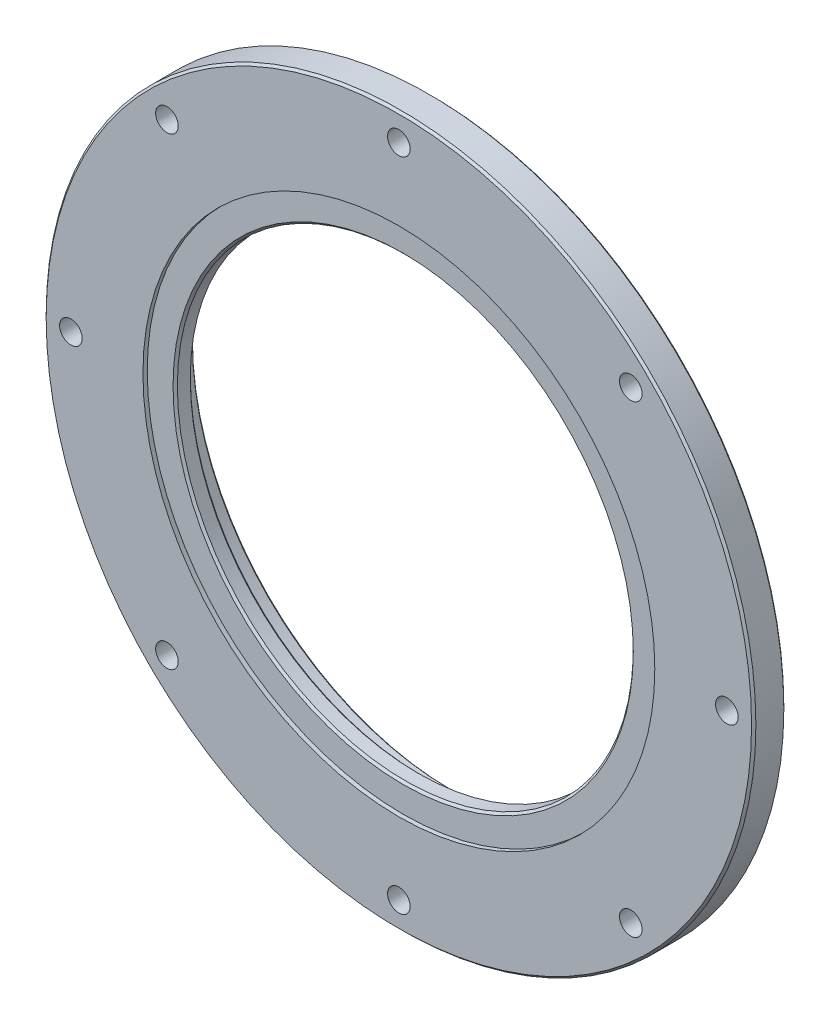
ISO-10303-21;
HEADER;
FILE_DESCRIPTION(('STEP AP214'),'2;1');
FILE_NAME('part.step','',(''),(''),'','','');
FILE_SCHEMA(('AUTOMOTIVE_DESIGN { 1 0 10303 214 1 1 1 1 }'));
ENDSEC;
DATA;
#1=APPLICATION_CONTEXT('core data for automotive mechanical design processes');
#2=APPLICATION_PROTOCOL_DEFINITION('international standard','automotive_design',2000,#1);
#3=PRODUCT_CONTEXT('',#1,'mechanical');
#4=PRODUCT('Part','Part','',(#3));
#5=PRODUCT_RELATED_PRODUCT_CATEGORY('part','',(#4));
#6=PRODUCT_DEFINITION_FORMATION('','',#4);
#7=PRODUCT_DEFINITION_CONTEXT('part definition',#1,'design');
#8=PRODUCT_DEFINITION('design','',#6,#7);
#9=PRODUCT_DEFINITION_SHAPE('','',#8);
#10=(LENGTH_UNIT() NAMED_UNIT(*) SI_UNIT(.MILLI.,.METRE.));
#11=(NAMED_UNIT(*) PLANE_ANGLE_UNIT() SI_UNIT($,.RADIAN.));
#12=(NAMED_UNIT(*) SI_UNIT($,.STERADIAN.) SOLID_ANGLE_UNIT());
#13=UNCERTAINTY_MEASURE_WITH_UNIT(LENGTH_MEASURE(1.E-05),#10,'distance_accuracy_value','');
#14=(GEOMETRIC_REPRESENTATION_CONTEXT(3) GLOBAL_UNCERTAINTY_ASSIGNED_CONTEXT((#13)) GLOBAL_UNIT_ASSIGNED_CONTEXT((#10,
#11,#12)) REPRESENTATION_CONTEXT('',''));
#15=CARTESIAN_POINT('',(0.,0.,0.));
#16=DIRECTION('',(0.,0.,1.));
#17=DIRECTION('',(1.,0.,0.));
#18=AXIS2_PLACEMENT_3D('',#15,#16,#17);
#19=CARTESIAN_POINT('',(0.,0.,0.));
#20=DIRECTION('',(0.,0.,-1.));
#21=DIRECTION('',(-1.,0.,0.));
#22=AXIS2_PLACEMENT_3D('',#19,#20,#21);
#23=CYLINDRICAL_SURFACE('',#22,165.);
#24=CARTESIAN_POINT('',(0.,0.,-14.0000000000001));
#25=DIRECTION('',(0.,0.,-1.));
#26=DIRECTION('',(-1.,0.,0.));
#27=AXIS2_PLACEMENT_3D('',#24,#25,#26);
#28=CIRCLE('',#27,165.);
#29=CARTESIAN_POINT('',(-165.,0.,-14.0000000000001));
#30=VERTEX_POINT('',#29);
#31=EDGE_CURVE('E60',#30,#30,#28,.F.);
#32=ORIENTED_EDGE('',*,*,#31,.T.);
#33=EDGE_LOOP('',(#32));
#34=FACE_BOUND('',#33,.T.);
#35=CARTESIAN_POINT('',(0.,0.,-1.00000000000004));
#36=DIRECTION('',(0.,0.,1.));
#37=DIRECTION('',(1.,0.,0.));
#38=AXIS2_PLACEMENT_3D('',#35,#36,#37);
#39=CIRCLE('',#38,165.);
#40=CARTESIAN_POINT('',(165.,0.,-1.00000000000004));
#41=VERTEX_POINT('',#40);
#42=EDGE_CURVE('E161',#41,#41,#39,.F.);
#43=ORIENTED_EDGE('',*,*,#42,.T.);
#44=EDGE_LOOP('',(#43));
#45=FACE_BOUND('',#44,.T.);
#46=ADVANCED_FACE('F51',(#34,#45),#23,.T.);
#47=CARTESIAN_POINT('',(165.,0.,0.));
#48=DIRECTION('',(0.,0.,1.));
#49=DIRECTION('',(1.,0.,0.));
#50=AXIS2_PLACEMENT_3D('',#47,#48,#49);
#51=PLANE('',#50);
#52=CARTESIAN_POINT('',(0.,0.,0.));
#53=DIRECTION('',(0.,0.,1.));
#54=DIRECTION('',(1.,0.,0.));
#55=AXIS2_PLACEMENT_3D('',#52,#53,#54);
#56=CIRCLE('',#55,164.);
#57=CARTESIAN_POINT('',(164.,0.,0.));
#58=VERTEX_POINT('',#57);
#59=EDGE_CURVE('E11',#58,#58,#56,.T.);
#60=ORIENTED_EDGE('',*,*,#59,.T.);
#61=EDGE_LOOP('',(#60));
#62=FACE_BOUND('',#61,.T.);
#63=CARTESIAN_POINT('',(-152.5,0.,0.));
#64=DIRECTION('',(0.,0.,-1.));
#65=DIRECTION('',(-1.,0.,0.));
#66=AXIS2_PLACEMENT_3D('',#63,#64,#65);
#67=CIRCLE('',#66,5.25);
#68=CARTESIAN_POINT('',(-157.75,0.,0.));
#69=VERTEX_POINT('',#68);
#70=EDGE_CURVE('E292',#69,#69,#67,.T.);
#71=ORIENTED_EDGE('',*,*,#70,.T.);
#72=EDGE_LOOP('',(#71));
#73=FACE_BOUND('',#72,.T.);
#74=CARTESIAN_POINT('',(-107.833784130948,-107.833784130949,0.));
#75=DIRECTION('',(0.,0.,-1.));
#76=DIRECTION('',(-1.,0.,0.));
#77=AXIS2_PLACEMENT_3D('',#74,#75,#76);
#78=CIRCLE('',#77,5.24999999999999);
#79=CARTESIAN_POINT('',(-113.083784130948,-107.833784130949,0.));
#80=VERTEX_POINT('',#79);
#81=EDGE_CURVE('E286',#80,#80,#78,.T.);
#82=ORIENTED_EDGE('',*,*,#81,.T.);
#83=EDGE_LOOP('',(#82));
#84=FACE_BOUND('',#83,.T.);
#85=CARTESIAN_POINT('',(0.,-152.5,0.));
#86=DIRECTION('',(0.,0.,-1.));
#87=DIRECTION('',(-1.,0.,0.));
#88=AXIS2_PLACEMENT_3D('',#85,#86,#87);
#89=CIRCLE('',#88,5.24999999999999);
#90=CARTESIAN_POINT('',(-5.24999999999996,-152.5,0.));
#91=VERTEX_POINT('',#90);
#92=EDGE_CURVE('E280',#91,#91,#89,.T.);
#93=ORIENTED_EDGE('',*,*,#92,.T.);
#94=EDGE_LOOP('',(#93));
#95=FACE_BOUND('',#94,.T.);
#96=CARTESIAN_POINT('',(107.833784130949,-107.833784130948,0.));
#97=DIRECTION('',(0.,0.,-1.));
#98=DIRECTION('',(-1.,0.,0.));
#99=AXIS2_PLACEMENT_3D('',#96,#97,#98);
#100=CIRCLE('',#99,5.24999999999999);
#101=CARTESIAN_POINT('',(102.583784130949,-107.833784130948,0.));
#102=VERTEX_POINT('',#101);
#103=EDGE_CURVE('E274',#102,#102,#100,.T.);
#104=ORIENTED_EDGE('',*,*,#103,.T.);
#105=EDGE_LOOP('',(#104));
#106=FACE_BOUND('',#105,.T.);
#107=CARTESIAN_POINT('',(152.5,0.,0.));
#108=DIRECTION('',(0.,0.,-1.));
#109=DIRECTION('',(-1.,0.,0.));
#110=AXIS2_PLACEMENT_3D('',#107,#108,#109);
#111=CIRCLE('',#110,5.25);
#112=CARTESIAN_POINT('',(147.25,0.,0.));
#113=VERTEX_POINT('',#112);
#114=EDGE_CURVE('E268',#113,#113,#111,.T.);
#115=ORIENTED_EDGE('',*,*,#114,.T.);
#116=EDGE_LOOP('',(#115));
#117=FACE_BOUND('',#116,.T.);
#118=CARTESIAN_POINT('',(107.833784130949,107.833784130948,0.));
#119=DIRECTION('',(0.,0.,-1.));
#120=DIRECTION('',(-1.,0.,0.));
#121=AXIS2_PLACEMENT_3D('',#118,#119,#120);
#122=CIRCLE('',#121,5.24999999999999);
#123=CARTESIAN_POINT('',(102.583784130949,107.833784130948,0.));
#124=VERTEX_POINT('',#123);
#125=EDGE_CURVE('E262',#124,#124,#122,.T.);
#126=ORIENTED_EDGE('',*,*,#125,.T.);
#127=EDGE_LOOP('',(#126));
#128=FACE_BOUND('',#127,.T.);
#129=CARTESIAN_POINT('',(0.,152.5,0.));
#130=DIRECTION('',(0.,0.,-1.));
#131=DIRECTION('',(-1.,0.,0.));
#132=AXIS2_PLACEMENT_3D('',#129,#130,#131);
#133=CIRCLE('',#132,5.24999999999999);
#134=CARTESIAN_POINT('',(-5.24999999999997,152.5,0.));
#135=VERTEX_POINT('',#134);
#136=EDGE_CURVE('E256',#135,#135,#133,.T.);
#137=ORIENTED_EDGE('',*,*,#136,.T.);
#138=EDGE_LOOP('',(#137));
#139=FACE_BOUND('',#138,.T.);
#140=CARTESIAN_POINT('',(-107.833784130948,107.833784130949,0.));
#141=DIRECTION('',(0.,0.,-1.));
#142=DIRECTION('',(-1.,0.,0.));
#143=AXIS2_PLACEMENT_3D('',#140,#141,#142);
#144=CIRCLE('',#143,5.24999999999999);
#145=CARTESIAN_POINT('',(-113.083784130948,107.833784130949,0.));
#146=VERTEX_POINT('',#145);
#147=EDGE_CURVE('E250',#146,#146,#144,.T.);
#148=ORIENTED_EDGE('',*,*,#147,.T.);
#149=EDGE_LOOP('',(#148));
#150=FACE_BOUND('',#149,.T.);
#151=CARTESIAN_POINT('',(0.,0.,0.));
#152=DIRECTION('',(0.,0.,-1.));
#153=DIRECTION('',(-1.,0.,0.));
#154=AXIS2_PLACEMENT_3D('',#151,#152,#153);
#155=CIRCLE('',#154,119.);
#156=CARTESIAN_POINT('',(-119.,0.,0.));
#157=VERTEX_POINT('',#156);
#158=EDGE_CURVE('E193',#157,#157,#155,.T.);
#159=ORIENTED_EDGE('',*,*,#158,.T.);
#160=EDGE_LOOP('',(#159));
#161=FACE_BOUND('',#160,.T.);
#162=ADVANCED_FACE('F103',(#62,#73,#84,#95,#106,#117,#128,#139,#150,#161),#51,.T.);
#163=CARTESIAN_POINT('',(0.,0.,-15.));
#164=DIRECTION('',(0.,0.,-1.));
#165=DIRECTION('',(-1.,0.,0.));
#166=AXIS2_PLACEMENT_3D('',#163,#164,#165);
#167=PLANE('',#166);
#168=CARTESIAN_POINT('',(0.,0.,-15.));
#169=DIRECTION('',(0.,0.,-1.));
#170=DIRECTION('',(-1.,0.,0.));
#171=AXIS2_PLACEMENT_3D('',#168,#169,#170);
#172=CIRCLE('',#171,164.);
#173=CARTESIAN_POINT('',(-164.,0.,-15.));
#174=VERTEX_POINT('',#173);
#175=EDGE_CURVE('E159',#174,#174,#172,.T.);
#176=ORIENTED_EDGE('',*,*,#175,.T.);
#177=EDGE_LOOP('',(#176));
#178=FACE_BOUND('',#177,.T.);
#179=CARTESIAN_POINT('',(-152.5,0.,-15.));
#180=DIRECTION('',(0.,0.,-1.));
#181=DIRECTION('',(-1.,0.,0.));
#182=AXIS2_PLACEMENT_3D('',#179,#180,#181);
#183=CIRCLE('',#182,5.25);
#184=CARTESIAN_POINT('',(-157.75,0.,-15.));
#185=VERTEX_POINT('',#184);
#186=EDGE_CURVE('E295',#185,#185,#183,.T.);
#187=ORIENTED_EDGE('',*,*,#186,.F.);
#188=EDGE_LOOP('',(#187));
#189=FACE_BOUND('',#188,.T.);
#190=CARTESIAN_POINT('',(-107.833784130948,-107.833784130949,-15.));
#191=DIRECTION('',(0.,0.,-1.));
#192=DIRECTION('',(-1.,0.,0.));
#193=AXIS2_PLACEMENT_3D('',#190,#191,#192);
#194=CIRCLE('',#193,5.24999999999999);
#195=CARTESIAN_POINT('',(-113.083784130948,-107.833784130949,-15.));
#196=VERTEX_POINT('',#195);
#197=EDGE_CURVE('E289',#196,#196,#194,.T.);
#198=ORIENTED_EDGE('',*,*,#197,.F.);
#199=EDGE_LOOP('',(#198));
#200=FACE_BOUND('',#199,.T.);
#201=CARTESIAN_POINT('',(0.,-152.5,-15.));
#202=DIRECTION('',(0.,0.,-1.));
#203=DIRECTION('',(-1.,0.,0.));
#204=AXIS2_PLACEMENT_3D('',#201,#202,#203);
#205=CIRCLE('',#204,5.24999999999999);
#206=CARTESIAN_POINT('',(-5.24999999999996,-152.5,-15.));
#207=VERTEX_POINT('',#206);
#208=EDGE_CURVE('E283',#207,#207,#205,.T.);
#209=ORIENTED_EDGE('',*,*,#208,.F.);
#210=EDGE_LOOP('',(#209));
#211=FACE_BOUND('',#210,.T.);
#212=CARTESIAN_POINT('',(107.833784130949,-107.833784130948,-15.));
#213=DIRECTION('',(0.,0.,-1.));
#214=DIRECTION('',(-1.,0.,0.));
#215=AXIS2_PLACEMENT_3D('',#212,#213,#214);
#216=CIRCLE('',#215,5.24999999999999);
#217=CARTESIAN_POINT('',(102.583784130949,-107.833784130948,-15.));
#218=VERTEX_POINT('',#217);
#219=EDGE_CURVE('E277',#218,#218,#216,.T.);
#220=ORIENTED_EDGE('',*,*,#219,.F.);
#221=EDGE_LOOP('',(#220));
#222=FACE_BOUND('',#221,.T.);
#223=CARTESIAN_POINT('',(152.5,0.,-15.));
#224=DIRECTION('',(0.,0.,-1.));
#225=DIRECTION('',(-1.,0.,0.));
#226=AXIS2_PLACEMENT_3D('',#223,#224,#225);
#227=CIRCLE('',#226,5.25);
#228=CARTESIAN_POINT('',(147.25,0.,-15.));
#229=VERTEX_POINT('',#228);
#230=EDGE_CURVE('E271',#229,#229,#227,.T.);
#231=ORIENTED_EDGE('',*,*,#230,.F.);
#232=EDGE_LOOP('',(#231));
#233=FACE_BOUND('',#232,.T.);
#234=CARTESIAN_POINT('',(107.833784130949,107.833784130948,-15.));
#235=DIRECTION('',(0.,0.,-1.));
#236=DIRECTION('',(-1.,0.,0.));
#237=AXIS2_PLACEMENT_3D('',#234,#235,#236);
#238=CIRCLE('',#237,5.24999999999999);
#239=CARTESIAN_POINT('',(102.583784130949,107.833784130948,-15.));
#240=VERTEX_POINT('',#239);
#241=EDGE_CURVE('E265',#240,#240,#238,.T.);
#242=ORIENTED_EDGE('',*,*,#241,.F.);
#243=EDGE_LOOP('',(#242));
#244=FACE_BOUND('',#243,.T.);
#245=CARTESIAN_POINT('',(0.,152.5,-15.));
#246=DIRECTION('',(0.,0.,-1.));
#247=DIRECTION('',(-1.,0.,0.));
#248=AXIS2_PLACEMENT_3D('',#245,#246,#247);
#249=CIRCLE('',#248,5.24999999999999);
#250=CARTESIAN_POINT('',(-5.24999999999997,152.5,-15.));
#251=VERTEX_POINT('',#250);
#252=EDGE_CURVE('E259',#251,#251,#249,.T.);
#253=ORIENTED_EDGE('',*,*,#252,.F.);
#254=EDGE_LOOP('',(#253));
#255=FACE_BOUND('',#254,.T.);
#256=CARTESIAN_POINT('',(-107.833784130948,107.833784130949,-15.));
#257=DIRECTION('',(0.,0.,-1.));
#258=DIRECTION('',(-1.,0.,0.));
#259=AXIS2_PLACEMENT_3D('',#256,#257,#258);
#260=CIRCLE('',#259,5.24999999999999);
#261=CARTESIAN_POINT('',(-113.083784130948,107.833784130949,-15.));
#262=VERTEX_POINT('',#261);
#263=EDGE_CURVE('E253',#262,#262,#260,.T.);
#264=ORIENTED_EDGE('',*,*,#263,.F.);
#265=EDGE_LOOP('',(#264));
#266=FACE_BOUND('',#265,.T.);
#267=CARTESIAN_POINT('',(0.,0.,-15.));
#268=DIRECTION('',(0.,0.,-1.));
#269=DIRECTION('',(-1.,0.,0.));
#270=AXIS2_PLACEMENT_3D('',#267,#268,#269);
#271=CIRCLE('',#270,140.);
#272=CARTESIAN_POINT('',(-140.,0.,-15.));
#273=VERTEX_POINT('',#272);
#274=EDGE_CURVE('E190',#273,#273,#271,.T.);
#275=ORIENTED_EDGE('',*,*,#274,.F.);
#276=EDGE_LOOP('',(#275));
#277=FACE_BOUND('',#276,.T.);
#278=ADVANCED_FACE('F110',(#178,#189,#200,#211,#222,#233,#244,#255,#266,#277),#167,.T.);
#279=CARTESIAN_POINT('',(0.,0.,-25.));
#280=DIRECTION('',(0.,0.,1.));
#281=DIRECTION('',(1.,0.,0.));
#282=AXIS2_PLACEMENT_3D('',#279,#280,#281);
#283=CYLINDRICAL_SURFACE('',#282,140.);
#284=CARTESIAN_POINT('',(0.,0.,-24.));
#285=DIRECTION('',(0.,0.,-1.));
#286=DIRECTION('',(-1.,0.,0.));
#287=AXIS2_PLACEMENT_3D('',#284,#285,#286);
#288=CIRCLE('',#287,140.);
#289=CARTESIAN_POINT('',(-140.,0.,-24.));
#290=VERTEX_POINT('',#289);
#291=EDGE_CURVE('E162',#290,#290,#288,.F.);
#292=ORIENTED_EDGE('',*,*,#291,.T.);
#293=EDGE_LOOP('',(#292));
#294=FACE_BOUND('',#293,.T.);
#295=ORIENTED_EDGE('',*,*,#274,.T.);
#296=EDGE_LOOP('',(#295));
#297=FACE_BOUND('',#296,.T.);
#298=ADVANCED_FACE('F302',(#294,#297),#283,.T.);
#299=CARTESIAN_POINT('',(0.,0.,-25.));
#300=DIRECTION('',(0.,0.,-1.));
#301=DIRECTION('',(-1.,0.,0.));
#302=AXIS2_PLACEMENT_3D('',#299,#300,#301);
#303=PLANE('',#302);
#304=CARTESIAN_POINT('',(0.,0.,-25.));
#305=DIRECTION('',(0.,0.,-1.));
#306=DIRECTION('',(-1.,0.,0.));
#307=AXIS2_PLACEMENT_3D('',#304,#305,#306);
#308=CIRCLE('',#307,121.);
#309=CARTESIAN_POINT('',(-121.,0.,-25.));
#310=VERTEX_POINT('',#309);
#311=EDGE_CURVE('E167',#310,#310,#308,.F.);
#312=ORIENTED_EDGE('',*,*,#311,.T.);
#313=EDGE_LOOP('',(#312));
#314=FACE_BOUND('',#313,.T.);
#315=CARTESIAN_POINT('',(0.,0.,-25.));
#316=DIRECTION('',(0.,0.,-1.));
#317=DIRECTION('',(-1.,0.,0.));
#318=AXIS2_PLACEMENT_3D('',#315,#316,#317);
#319=CIRCLE('',#318,139.);
#320=CARTESIAN_POINT('',(-139.,0.,-25.));
#321=VERTEX_POINT('',#320);
#322=EDGE_CURVE('E172',#321,#321,#319,.T.);
#323=ORIENTED_EDGE('',*,*,#322,.T.);
#324=EDGE_LOOP('',(#323));
#325=FACE_BOUND('',#324,.T.);
#326=CARTESIAN_POINT('',(-120.104339226467,49.7488462074617,-25.));
#327=DIRECTION('',(0.,0.,1.));
#328=DIRECTION('',(1.,0.,0.));
#329=AXIS2_PLACEMENT_3D('',#326,#327,#328);
#330=CIRCLE('',#329,3.32349999999999);
#331=CARTESIAN_POINT('',(-116.780839226467,49.7488462074617,-25.));
#332=VERTEX_POINT('',#331);
#333=EDGE_CURVE('E244',#332,#332,#330,.T.);
#334=ORIENTED_EDGE('',*,*,#333,.T.);
#335=EDGE_LOOP('',(#334));
#336=FACE_BOUND('',#335,.T.);
#337=CARTESIAN_POINT('',(-49.7488462074617,120.104339226467,-25.));
#338=DIRECTION('',(0.,0.,1.));
#339=DIRECTION('',(1.,0.,0.));
#340=AXIS2_PLACEMENT_3D('',#337,#338,#339);
#341=CIRCLE('',#340,3.3235);
#342=CARTESIAN_POINT('',(-46.4253462074617,120.104339226467,-25.));
#343=VERTEX_POINT('',#342);
#344=EDGE_CURVE('E238',#343,#343,#341,.T.);
#345=ORIENTED_EDGE('',*,*,#344,.T.);
#346=EDGE_LOOP('',(#345));
#347=FACE_BOUND('',#346,.T.);
#348=CARTESIAN_POINT('',(49.7488462074617,120.104339226467,-25.));
#349=DIRECTION('',(0.,0.,1.));
#350=DIRECTION('',(1.,0.,0.));
#351=AXIS2_PLACEMENT_3D('',#348,#349,#350);
#352=CIRCLE('',#351,3.3235);
#353=CARTESIAN_POINT('',(53.0723462074617,120.104339226467,-25.));
#354=VERTEX_POINT('',#353);
#355=EDGE_CURVE('E232',#354,#354,#352,.T.);
#356=ORIENTED_EDGE('',*,*,#355,.T.);
#357=EDGE_LOOP('',(#356));
#358=FACE_BOUND('',#357,.T.);
#359=CARTESIAN_POINT('',(120.104339226467,49.7488462074617,-25.));
#360=DIRECTION('',(0.,0.,1.));
#361=DIRECTION('',(1.,0.,0.));
#362=AXIS2_PLACEMENT_3D('',#359,#360,#361);
#363=CIRCLE('',#362,3.32349999999999);
#364=CARTESIAN_POINT('',(123.427839226467,49.7488462074617,-25.));
#365=VERTEX_POINT('',#364);
#366=EDGE_CURVE('E226',#365,#365,#363,.T.);
#367=ORIENTED_EDGE('',*,*,#366,.T.);
#368=EDGE_LOOP('',(#367));
#369=FACE_BOUND('',#368,.T.);
#370=CARTESIAN_POINT('',(120.104339226467,-49.7488462074617,-25.));
#371=DIRECTION('',(0.,0.,1.));
#372=DIRECTION('',(1.,0.,0.));
#373=AXIS2_PLACEMENT_3D('',#370,#371,#372);
#374=CIRCLE('',#373,3.32349999999999);
#375=CARTESIAN_POINT('',(123.427839226467,-49.7488462074617,-25.));
#376=VERTEX_POINT('',#375);
#377=EDGE_CURVE('E220',#376,#376,#374,.T.);
#378=ORIENTED_EDGE('',*,*,#377,.T.);
#379=EDGE_LOOP('',(#378));
#380=FACE_BOUND('',#379,.T.);
#381=CARTESIAN_POINT('',(49.7488462074617,-120.104339226467,-25.));
#382=DIRECTION('',(0.,0.,1.));
#383=DIRECTION('',(1.,0.,0.));
#384=AXIS2_PLACEMENT_3D('',#381,#382,#383);
#385=CIRCLE('',#384,3.3235);
#386=CARTESIAN_POINT('',(53.0723462074617,-120.104339226467,-25.));
#387=VERTEX_POINT('',#386);
#388=EDGE_CURVE('E214',#387,#387,#385,.T.);
#389=ORIENTED_EDGE('',*,*,#388,.T.);
#390=EDGE_LOOP('',(#389));
#391=FACE_BOUND('',#390,.T.);
#392=CARTESIAN_POINT('',(-49.7488462074616,-120.104339226467,-25.));
#393=DIRECTION('',(0.,0.,1.));
#394=DIRECTION('',(1.,0.,0.));
#395=AXIS2_PLACEMENT_3D('',#392,#393,#394);
#396=CIRCLE('',#395,3.3235);
#397=CARTESIAN_POINT('',(-46.4253462074616,-120.104339226467,-25.));
#398=VERTEX_POINT('',#397);
#399=EDGE_CURVE('E208',#398,#398,#396,.T.);
#400=ORIENTED_EDGE('',*,*,#399,.T.);
#401=EDGE_LOOP('',(#400));
#402=FACE_BOUND('',#401,.T.);
#403=CARTESIAN_POINT('',(-120.104339226467,-49.7488462074617,-25.));
#404=DIRECTION('',(0.,0.,1.));
#405=DIRECTION('',(1.,0.,0.));
#406=AXIS2_PLACEMENT_3D('',#403,#404,#405);
#407=CIRCLE('',#406,3.32349999999999);
#408=CARTESIAN_POINT('',(-116.780839226467,-49.7488462074617,-25.));
#409=VERTEX_POINT('',#408);
#410=EDGE_CURVE('E202',#409,#409,#407,.T.);
#411=ORIENTED_EDGE('',*,*,#410,.T.);
#412=EDGE_LOOP('',(#411));
#413=FACE_BOUND('',#412,.T.);
#414=ADVANCED_FACE('F320',(#314,#325,#336,#347,#358,#369,#380,#391,#402,#413),#303,.T.);
#415=CARTESIAN_POINT('',(0.,0.,0.));
#416=DIRECTION('',(0.,0.,-1.));
#417=DIRECTION('',(-1.,0.,0.));
#418=AXIS2_PLACEMENT_3D('',#415,#416,#417);
#419=CYLINDRICAL_SURFACE('',#418,119.);
#420=ORIENTED_EDGE('',*,*,#158,.F.);
#421=EDGE_LOOP('',(#420));
#422=FACE_BOUND('',#421,.T.);
#423=CARTESIAN_POINT('',(0.,0.,-2.));
#424=DIRECTION('',(0.,0.,-1.));
#425=DIRECTION('',(-1.,0.,0.));
#426=AXIS2_PLACEMENT_3D('',#423,#424,#425);
#427=CIRCLE('',#426,119.);
#428=CARTESIAN_POINT('',(-119.,0.,-2.));
#429=VERTEX_POINT('',#428);
#430=EDGE_CURVE('E199',#429,#429,#427,.T.);
#431=ORIENTED_EDGE('',*,*,#430,.T.);
#432=EDGE_LOOP('',(#431));
#433=FACE_BOUND('',#432,.T.);
#434=ADVANCED_FACE('F326',(#422,#433),#419,.F.);
#435=CARTESIAN_POINT('',(0.,0.,0.));
#436=DIRECTION('',(0.,0.,-1.));
#437=DIRECTION('',(-1.,0.,0.));
#438=AXIS2_PLACEMENT_3D('',#435,#436,#437);
#439=CYLINDRICAL_SURFACE('',#438,120.);
#440=CARTESIAN_POINT('',(0.,0.,-24.));
#441=DIRECTION('',(0.,0.,-1.));
#442=DIRECTION('',(-1.,0.,0.));
#443=AXIS2_PLACEMENT_3D('',#440,#441,#442);
#444=CIRCLE('',#443,120.);
#445=CARTESIAN_POINT('',(-120.,0.,-24.));
#446=VERTEX_POINT('',#445);
#447=EDGE_CURVE('E175',#446,#446,#444,.T.);
#448=ORIENTED_EDGE('',*,*,#447,.T.);
#449=EDGE_LOOP('',(#448));
#450=FACE_BOUND('',#449,.T.);
#451=CARTESIAN_POINT('',(0.,0.,-10.));
#452=DIRECTION('',(0.,0.,-1.));
#453=DIRECTION('',(-1.,0.,0.));
#454=AXIS2_PLACEMENT_3D('',#451,#452,#453);
#455=CIRCLE('',#454,120.);
#456=CARTESIAN_POINT('',(-120.,0.,-10.));
#457=VERTEX_POINT('',#456);
#458=EDGE_CURVE('E196',#457,#457,#455,.T.);
#459=ORIENTED_EDGE('',*,*,#458,.F.);
#460=EDGE_LOOP('',(#459));
#461=FACE_BOUND('',#460,.T.);
#462=ADVANCED_FACE('F332',(#450,#461),#439,.F.);
#463=CARTESIAN_POINT('',(120.,0.,-10.));
#464=DIRECTION('',(0.,0.,1.));
#465=DIRECTION('',(1.,0.,0.));
#466=AXIS2_PLACEMENT_3D('',#463,#464,#465);
#467=PLANE('',#466);
#468=CARTESIAN_POINT('',(0.,0.,-10.));
#469=DIRECTION('',(0.,0.,1.));
#470=DIRECTION('',(1.,0.,0.));
#471=AXIS2_PLACEMENT_3D('',#468,#469,#470);
#472=CIRCLE('',#471,107.);
#473=CARTESIAN_POINT('',(107.,0.,-10.));
#474=VERTEX_POINT('',#473);
#475=EDGE_CURVE('E178',#474,#474,#472,.T.);
#476=ORIENTED_EDGE('',*,*,#475,.T.);
#477=EDGE_LOOP('',(#476));
#478=FACE_BOUND('',#477,.T.);
#479=ORIENTED_EDGE('',*,*,#458,.T.);
#480=EDGE_LOOP('',(#479));
#481=FACE_BOUND('',#480,.T.);
#482=ADVANCED_FACE('F336',(#478,#481),#467,.F.);
#483=CARTESIAN_POINT('',(0.,0.,0.));
#484=DIRECTION('',(0.,0.,-1.));
#485=DIRECTION('',(-1.,0.,0.));
#486=AXIS2_PLACEMENT_3D('',#483,#484,#485);
#487=CYLINDRICAL_SURFACE('',#486,106.);
#488=CARTESIAN_POINT('',(0.,0.,-3.));
#489=DIRECTION('',(0.,0.,-1.));
#490=DIRECTION('',(-1.,0.,0.));
#491=AXIS2_PLACEMENT_3D('',#488,#489,#490);
#492=CIRCLE('',#491,106.);
#493=CARTESIAN_POINT('',(-106.,0.,-3.));
#494=VERTEX_POINT('',#493);
#495=EDGE_CURVE('E181',#494,#494,#492,.F.);
#496=ORIENTED_EDGE('',*,*,#495,.T.);
#497=EDGE_LOOP('',(#496));
#498=FACE_BOUND('',#497,.T.);
#499=CARTESIAN_POINT('',(0.,0.,-9.00000000000008));
#500=DIRECTION('',(0.,0.,1.));
#501=DIRECTION('',(1.,0.,0.));
#502=AXIS2_PLACEMENT_3D('',#499,#500,#501);
#503=CIRCLE('',#502,106.);
#504=CARTESIAN_POINT('',(106.,0.,-9.00000000000008));
#505=VERTEX_POINT('',#504);
#506=EDGE_CURVE('E184',#505,#505,#503,.F.);
#507=ORIENTED_EDGE('',*,*,#506,.T.);
#508=EDGE_LOOP('',(#507));
#509=FACE_BOUND('',#508,.T.);
#510=ADVANCED_FACE('F340',(#498,#509),#487,.F.);
#511=CARTESIAN_POINT('',(106.,0.,-2.));
#512=DIRECTION('',(0.,0.,-1.));
#513=DIRECTION('',(-1.,0.,0.));
#514=AXIS2_PLACEMENT_3D('',#511,#512,#513);
#515=PLANE('',#514);
#516=CARTESIAN_POINT('',(0.,0.,-2.));
#517=DIRECTION('',(0.,0.,-1.));
#518=DIRECTION('',(-1.,0.,0.));
#519=AXIS2_PLACEMENT_3D('',#516,#517,#518);
#520=CIRCLE('',#519,107.);
#521=CARTESIAN_POINT('',(-107.,0.,-2.));
#522=VERTEX_POINT('',#521);
#523=EDGE_CURVE('E187',#522,#522,#520,.T.);
#524=ORIENTED_EDGE('',*,*,#523,.T.);
#525=EDGE_LOOP('',(#524));
#526=FACE_BOUND('',#525,.T.);
#527=ORIENTED_EDGE('',*,*,#430,.F.);
#528=EDGE_LOOP('',(#527));
#529=FACE_BOUND('',#528,.T.);
#530=ADVANCED_FACE('F344',(#526,#529),#515,.F.);
#531=CARTESIAN_POINT('',(-120.104339226467,-49.7488462074617,-10.));
#532=DIRECTION('',(0.,0.,-1.));
#533=DIRECTION('',(-1.,0.,0.));
#534=AXIS2_PLACEMENT_3D('',#531,#532,#533);
#535=CONICAL_SURFACE('',#534,0.,1.02974425867665);
#536=CARTESIAN_POINT('',(-120.104339226467,-49.7488462074617,-11.9969602673381));
#537=DIRECTION('',(0.,0.,1.));
#538=DIRECTION('',(1.,0.,0.));
#539=AXIS2_PLACEMENT_3D('',#536,#537,#538);
#540=CIRCLE('',#539,3.32349999999999);
#541=CARTESIAN_POINT('',(-116.780839226467,-49.7488462074617,-11.9969602673381));
#542=VERTEX_POINT('',#541);
#543=EDGE_CURVE('E205',#542,#542,#540,.T.);
#544=ORIENTED_EDGE('',*,*,#543,.F.);
#545=EDGE_LOOP('',(#544));
#546=FACE_BOUND('',#545,.T.);
#547=CARTESIAN_POINT('',(-120.104339226467,-49.7488462074617,-10.));
#548=VERTEX_POINT('',#547);
#549=VERTEX_LOOP('',#548);
#550=FACE_BOUND('',#549,.T.);
#551=ADVANCED_FACE('F348',(#546,#550),#535,.F.);
#552=CARTESIAN_POINT('',(-120.104339226467,-49.7488462074617,-25.));
#553=DIRECTION('',(0.,0.,1.));
#554=DIRECTION('',(1.,0.,0.));
#555=AXIS2_PLACEMENT_3D('',#552,#553,#554);
#556=CYLINDRICAL_SURFACE('',#555,3.32349999999999);
#557=ORIENTED_EDGE('',*,*,#410,.F.);
#558=EDGE_LOOP('',(#557));
#559=FACE_BOUND('',#558,.T.);
#560=ORIENTED_EDGE('',*,*,#543,.T.);
#561=EDGE_LOOP('',(#560));
#562=FACE_BOUND('',#561,.T.);
#563=ADVANCED_FACE('F352',(#559,#562),#556,.F.);
#564=CARTESIAN_POINT('',(-49.7488462074616,-120.104339226467,-10.));
#565=DIRECTION('',(0.,0.,-1.));
#566=DIRECTION('',(-1.,0.,0.));
#567=AXIS2_PLACEMENT_3D('',#564,#565,#566);
#568=CONICAL_SURFACE('',#567,0.,1.02974425867665);
#569=CARTESIAN_POINT('',(-49.7488462074616,-120.104339226467,-11.9969602673381));
#570=DIRECTION('',(0.,0.,1.));
#571=DIRECTION('',(1.,0.,0.));
#572=AXIS2_PLACEMENT_3D('',#569,#570,#571);
#573=CIRCLE('',#572,3.3235);
#574=CARTESIAN_POINT('',(-46.4253462074616,-120.104339226467,-11.9969602673381));
#575=VERTEX_POINT('',#574);
#576=EDGE_CURVE('E211',#575,#575,#573,.T.);
#577=ORIENTED_EDGE('',*,*,#576,.F.);
#578=EDGE_LOOP('',(#577));
#579=FACE_BOUND('',#578,.T.);
#580=CARTESIAN_POINT('',(-49.7488462074616,-120.104339226467,-10.));
#581=VERTEX_POINT('',#580);
#582=VERTEX_LOOP('',#581);
#583=FACE_BOUND('',#582,.T.);
#584=ADVANCED_FACE('F356',(#579,#583),#568,.F.);
#585=CARTESIAN_POINT('',(-49.7488462074616,-120.104339226467,-25.));
#586=DIRECTION('',(0.,0.,1.));
#587=DIRECTION('',(1.,0.,0.));
#588=AXIS2_PLACEMENT_3D('',#585,#586,#587);
#589=CYLINDRICAL_SURFACE('',#588,3.3235);
#590=ORIENTED_EDGE('',*,*,#399,.F.);
#591=EDGE_LOOP('',(#590));
#592=FACE_BOUND('',#591,.T.);
#593=ORIENTED_EDGE('',*,*,#576,.T.);
#594=EDGE_LOOP('',(#593));
#595=FACE_BOUND('',#594,.T.);
#596=ADVANCED_FACE('F360',(#592,#595),#589,.F.);
#597=CARTESIAN_POINT('',(49.7488462074617,-120.104339226467,-10.));
#598=DIRECTION('',(0.,0.,-1.));
#599=DIRECTION('',(-1.,0.,0.));
#600=AXIS2_PLACEMENT_3D('',#597,#598,#599);
#601=CONICAL_SURFACE('',#600,0.,1.02974425867665);
#602=CARTESIAN_POINT('',(49.7488462074617,-120.104339226467,-11.9969602673381));
#603=DIRECTION('',(0.,0.,1.));
#604=DIRECTION('',(1.,0.,0.));
#605=AXIS2_PLACEMENT_3D('',#602,#603,#604);
#606=CIRCLE('',#605,3.3235);
#607=CARTESIAN_POINT('',(53.0723462074617,-120.104339226467,-11.9969602673381));
#608=VERTEX_POINT('',#607);
#609=EDGE_CURVE('E217',#608,#608,#606,.T.);
#610=ORIENTED_EDGE('',*,*,#609,.F.);
#611=EDGE_LOOP('',(#610));
#612=FACE_BOUND('',#611,.T.);
#613=CARTESIAN_POINT('',(49.7488462074617,-120.104339226467,-10.));
#614=VERTEX_POINT('',#613);
#615=VERTEX_LOOP('',#614);
#616=FACE_BOUND('',#615,.T.);
#617=ADVANCED_FACE('F364',(#612,#616),#601,.F.);
#618=CARTESIAN_POINT('',(49.7488462074617,-120.104339226467,-25.));
#619=DIRECTION('',(0.,0.,1.));
#620=DIRECTION('',(1.,0.,0.));
#621=AXIS2_PLACEMENT_3D('',#618,#619,#620);
#622=CYLINDRICAL_SURFACE('',#621,3.3235);
#623=ORIENTED_EDGE('',*,*,#388,.F.);
#624=EDGE_LOOP('',(#623));
#625=FACE_BOUND('',#624,.T.);
#626=ORIENTED_EDGE('',*,*,#609,.T.);
#627=EDGE_LOOP('',(#626));
#628=FACE_BOUND('',#627,.T.);
#629=ADVANCED_FACE('F368',(#625,#628),#622,.F.);
#630=CARTESIAN_POINT('',(120.104339226467,-49.7488462074617,-10.));
#631=DIRECTION('',(0.,0.,-1.));
#632=DIRECTION('',(-1.,0.,0.));
#633=AXIS2_PLACEMENT_3D('',#630,#631,#632);
#634=CONICAL_SURFACE('',#633,0.,1.02974425867665);
#635=CARTESIAN_POINT('',(120.104339226467,-49.7488462074617,-11.9969602673381));
#636=DIRECTION('',(0.,0.,1.));
#637=DIRECTION('',(1.,0.,0.));
#638=AXIS2_PLACEMENT_3D('',#635,#636,#637);
#639=CIRCLE('',#638,3.32349999999999);
#640=CARTESIAN_POINT('',(123.427839226467,-49.7488462074617,-11.9969602673381));
#641=VERTEX_POINT('',#640);
#642=EDGE_CURVE('E223',#641,#641,#639,.T.);
#643=ORIENTED_EDGE('',*,*,#642,.F.);
#644=EDGE_LOOP('',(#643));
#645=FACE_BOUND('',#644,.T.);
#646=CARTESIAN_POINT('',(120.104339226467,-49.7488462074617,-10.));
#647=VERTEX_POINT('',#646);
#648=VERTEX_LOOP('',#647);
#649=FACE_BOUND('',#648,.T.);
#650=ADVANCED_FACE('F372',(#645,#649),#634,.F.);
#651=CARTESIAN_POINT('',(120.104339226467,-49.7488462074617,-25.));
#652=DIRECTION('',(0.,0.,1.));
#653=DIRECTION('',(1.,0.,0.));
#654=AXIS2_PLACEMENT_3D('',#651,#652,#653);
#655=CYLINDRICAL_SURFACE('',#654,3.32349999999999);
#656=ORIENTED_EDGE('',*,*,#377,.F.);
#657=EDGE_LOOP('',(#656));
#658=FACE_BOUND('',#657,.T.);
#659=ORIENTED_EDGE('',*,*,#642,.T.);
#660=EDGE_LOOP('',(#659));
#661=FACE_BOUND('',#660,.T.);
#662=ADVANCED_FACE('F376',(#658,#661),#655,.F.);
#663=CARTESIAN_POINT('',(120.104339226467,49.7488462074617,-10.));
#664=DIRECTION('',(0.,0.,-1.));
#665=DIRECTION('',(-1.,0.,0.));
#666=AXIS2_PLACEMENT_3D('',#663,#664,#665);
#667=CONICAL_SURFACE('',#666,0.,1.02974425867665);
#668=CARTESIAN_POINT('',(120.104339226467,49.7488462074617,-11.9969602673381));
#669=DIRECTION('',(0.,0.,1.));
#670=DIRECTION('',(1.,0.,0.));
#671=AXIS2_PLACEMENT_3D('',#668,#669,#670);
#672=CIRCLE('',#671,3.32349999999999);
#673=CARTESIAN_POINT('',(123.427839226467,49.7488462074617,-11.9969602673381));
#674=VERTEX_POINT('',#673);
#675=EDGE_CURVE('E229',#674,#674,#672,.T.);
#676=ORIENTED_EDGE('',*,*,#675,.F.);
#677=EDGE_LOOP('',(#676));
#678=FACE_BOUND('',#677,.T.);
#679=CARTESIAN_POINT('',(120.104339226467,49.7488462074617,-10.));
#680=VERTEX_POINT('',#679);
#681=VERTEX_LOOP('',#680);
#682=FACE_BOUND('',#681,.T.);
#683=ADVANCED_FACE('F380',(#678,#682),#667,.F.);
#684=CARTESIAN_POINT('',(120.104339226467,49.7488462074617,-25.));
#685=DIRECTION('',(0.,0.,1.));
#686=DIRECTION('',(1.,0.,0.));
#687=AXIS2_PLACEMENT_3D('',#684,#685,#686);
#688=CYLINDRICAL_SURFACE('',#687,3.32349999999999);
#689=ORIENTED_EDGE('',*,*,#366,.F.);
#690=EDGE_LOOP('',(#689));
#691=FACE_BOUND('',#690,.T.);
#692=ORIENTED_EDGE('',*,*,#675,.T.);
#693=EDGE_LOOP('',(#692));
#694=FACE_BOUND('',#693,.T.);
#695=ADVANCED_FACE('F384',(#691,#694),#688,.F.);
#696=CARTESIAN_POINT('',(49.7488462074617,120.104339226467,-10.));
#697=DIRECTION('',(0.,0.,-1.));
#698=DIRECTION('',(-1.,0.,0.));
#699=AXIS2_PLACEMENT_3D('',#696,#697,#698);
#700=CONICAL_SURFACE('',#699,0.,1.02974425867665);
#701=CARTESIAN_POINT('',(49.7488462074617,120.104339226467,-11.9969602673381));
#702=DIRECTION('',(0.,0.,1.));
#703=DIRECTION('',(1.,0.,0.));
#704=AXIS2_PLACEMENT_3D('',#701,#702,#703);
#705=CIRCLE('',#704,3.3235);
#706=CARTESIAN_POINT('',(53.0723462074617,120.104339226467,-11.9969602673381));
#707=VERTEX_POINT('',#706);
#708=EDGE_CURVE('E235',#707,#707,#705,.T.);
#709=ORIENTED_EDGE('',*,*,#708,.F.);
#710=EDGE_LOOP('',(#709));
#711=FACE_BOUND('',#710,.T.);
#712=CARTESIAN_POINT('',(49.7488462074617,120.104339226467,-10.));
#713=VERTEX_POINT('',#712);
#714=VERTEX_LOOP('',#713);
#715=FACE_BOUND('',#714,.T.);
#716=ADVANCED_FACE('F388',(#711,#715),#700,.F.);
#717=CARTESIAN_POINT('',(49.7488462074617,120.104339226467,-25.));
#718=DIRECTION('',(0.,0.,1.));
#719=DIRECTION('',(1.,0.,0.));
#720=AXIS2_PLACEMENT_3D('',#717,#718,#719);
#721=CYLINDRICAL_SURFACE('',#720,3.3235);
#722=ORIENTED_EDGE('',*,*,#355,.F.);
#723=EDGE_LOOP('',(#722));
#724=FACE_BOUND('',#723,.T.);
#725=ORIENTED_EDGE('',*,*,#708,.T.);
#726=EDGE_LOOP('',(#725));
#727=FACE_BOUND('',#726,.T.);
#728=ADVANCED_FACE('F392',(#724,#727),#721,.F.);
#729=CARTESIAN_POINT('',(-49.7488462074617,120.104339226467,-10.));
#730=DIRECTION('',(0.,0.,-1.));
#731=DIRECTION('',(-1.,0.,0.));
#732=AXIS2_PLACEMENT_3D('',#729,#730,#731);
#733=CONICAL_SURFACE('',#732,0.,1.02974425867665);
#734=CARTESIAN_POINT('',(-49.7488462074617,120.104339226467,-11.9969602673381));
#735=DIRECTION('',(0.,0.,1.));
#736=DIRECTION('',(1.,0.,0.));
#737=AXIS2_PLACEMENT_3D('',#734,#735,#736);
#738=CIRCLE('',#737,3.3235);
#739=CARTESIAN_POINT('',(-46.4253462074617,120.104339226467,-11.9969602673381));
#740=VERTEX_POINT('',#739);
#741=EDGE_CURVE('E241',#740,#740,#738,.T.);
#742=ORIENTED_EDGE('',*,*,#741,.F.);
#743=EDGE_LOOP('',(#742));
#744=FACE_BOUND('',#743,.T.);
#745=CARTESIAN_POINT('',(-49.7488462074617,120.104339226467,-10.));
#746=VERTEX_POINT('',#745);
#747=VERTEX_LOOP('',#746);
#748=FACE_BOUND('',#747,.T.);
#749=ADVANCED_FACE('F98',(#744,#748),#733,.F.);
#750=CARTESIAN_POINT('',(-49.7488462074617,120.104339226467,-25.));
#751=DIRECTION('',(0.,0.,1.));
#752=DIRECTION('',(1.,0.,0.));
#753=AXIS2_PLACEMENT_3D('',#750,#751,#752);
#754=CYLINDRICAL_SURFACE('',#753,3.3235);
#755=ORIENTED_EDGE('',*,*,#344,.F.);
#756=EDGE_LOOP('',(#755));
#757=FACE_BOUND('',#756,.T.);
#758=ORIENTED_EDGE('',*,*,#741,.T.);
#759=EDGE_LOOP('',(#758));
#760=FACE_BOUND('',#759,.T.);
#761=ADVANCED_FACE('F88',(#757,#760),#754,.F.);
#762=CARTESIAN_POINT('',(-120.104339226467,49.7488462074617,-10.));
#763=DIRECTION('',(0.,0.,-1.));
#764=DIRECTION('',(-1.,0.,0.));
#765=AXIS2_PLACEMENT_3D('',#762,#763,#764);
#766=CONICAL_SURFACE('',#765,0.,1.02974425867665);
#767=CARTESIAN_POINT('',(-120.104339226467,49.7488462074617,-11.9969602673381));
#768=DIRECTION('',(0.,0.,1.));
#769=DIRECTION('',(1.,0.,0.));
#770=AXIS2_PLACEMENT_3D('',#767,#768,#769);
#771=CIRCLE('',#770,3.32349999999999);
#772=CARTESIAN_POINT('',(-116.780839226467,49.7488462074617,-11.9969602673381));
#773=VERTEX_POINT('',#772);
#774=EDGE_CURVE('E247',#773,#773,#771,.T.);
#775=ORIENTED_EDGE('',*,*,#774,.F.);
#776=EDGE_LOOP('',(#775));
#777=FACE_BOUND('',#776,.T.);
#778=CARTESIAN_POINT('',(-120.104339226467,49.7488462074617,-10.));
#779=VERTEX_POINT('',#778);
#780=VERTEX_LOOP('',#779);
#781=FACE_BOUND('',#780,.T.);
#782=ADVANCED_FACE('F85',(#777,#781),#766,.F.);
#783=CARTESIAN_POINT('',(-120.104339226467,49.7488462074617,-25.));
#784=DIRECTION('',(0.,0.,1.));
#785=DIRECTION('',(1.,0.,0.));
#786=AXIS2_PLACEMENT_3D('',#783,#784,#785);
#787=CYLINDRICAL_SURFACE('',#786,3.32349999999999);
#788=ORIENTED_EDGE('',*,*,#333,.F.);
#789=EDGE_LOOP('',(#788));
#790=FACE_BOUND('',#789,.T.);
#791=ORIENTED_EDGE('',*,*,#774,.T.);
#792=EDGE_LOOP('',(#791));
#793=FACE_BOUND('',#792,.T.);
#794=ADVANCED_FACE('F87',(#790,#793),#787,.F.);
#795=CARTESIAN_POINT('',(-107.833784130948,107.833784130949,-15.));
#796=DIRECTION('',(0.,0.,-1.));
#797=DIRECTION('',(-1.,0.,0.));
#798=AXIS2_PLACEMENT_3D('',#795,#796,#797);
#799=CYLINDRICAL_SURFACE('',#798,5.24999999999999);
#800=ORIENTED_EDGE('',*,*,#147,.F.);
#801=EDGE_LOOP('',(#800));
#802=FACE_BOUND('',#801,.T.);
#803=ORIENTED_EDGE('',*,*,#263,.T.);
#804=EDGE_LOOP('',(#803));
#805=FACE_BOUND('',#804,.T.);
#806=ADVANCED_FACE('F95',(#802,#805),#799,.F.);
#807=CARTESIAN_POINT('',(0.,152.5,-15.));
#808=DIRECTION('',(0.,0.,-1.));
#809=DIRECTION('',(-1.,0.,0.));
#810=AXIS2_PLACEMENT_3D('',#807,#808,#809);
#811=CYLINDRICAL_SURFACE('',#810,5.24999999999999);
#812=ORIENTED_EDGE('',*,*,#136,.F.);
#813=EDGE_LOOP('',(#812));
#814=FACE_BOUND('',#813,.T.);
#815=ORIENTED_EDGE('',*,*,#252,.T.);
#816=EDGE_LOOP('',(#815));
#817=FACE_BOUND('',#816,.T.);
#818=ADVANCED_FACE('F436',(#814,#817),#811,.F.);
#819=CARTESIAN_POINT('',(107.833784130949,107.833784130948,-15.));
#820=DIRECTION('',(0.,0.,-1.));
#821=DIRECTION('',(-1.,0.,0.));
#822=AXIS2_PLACEMENT_3D('',#819,#820,#821);
#823=CYLINDRICAL_SURFACE('',#822,5.24999999999999);
#824=ORIENTED_EDGE('',*,*,#125,.F.);
#825=EDGE_LOOP('',(#824));
#826=FACE_BOUND('',#825,.T.);
#827=ORIENTED_EDGE('',*,*,#241,.T.);
#828=EDGE_LOOP('',(#827));
#829=FACE_BOUND('',#828,.T.);
#830=ADVANCED_FACE('F446',(#826,#829),#823,.F.);
#831=CARTESIAN_POINT('',(152.5,0.,-15.));
#832=DIRECTION('',(0.,0.,-1.));
#833=DIRECTION('',(-1.,0.,0.));
#834=AXIS2_PLACEMENT_3D('',#831,#832,#833);
#835=CYLINDRICAL_SURFACE('',#834,5.25);
#836=ORIENTED_EDGE('',*,*,#114,.F.);
#837=EDGE_LOOP('',(#836));
#838=FACE_BOUND('',#837,.T.);
#839=ORIENTED_EDGE('',*,*,#230,.T.);
#840=EDGE_LOOP('',(#839));
#841=FACE_BOUND('',#840,.T.);
#842=ADVANCED_FACE('F456',(#838,#841),#835,.F.);
#843=CARTESIAN_POINT('',(107.833784130949,-107.833784130948,-15.));
#844=DIRECTION('',(0.,0.,-1.));
#845=DIRECTION('',(-1.,0.,0.));
#846=AXIS2_PLACEMENT_3D('',#843,#844,#845);
#847=CYLINDRICAL_SURFACE('',#846,5.24999999999999);
#848=ORIENTED_EDGE('',*,*,#103,.F.);
#849=EDGE_LOOP('',(#848));
#850=FACE_BOUND('',#849,.T.);
#851=ORIENTED_EDGE('',*,*,#219,.T.);
#852=EDGE_LOOP('',(#851));
#853=FACE_BOUND('',#852,.T.);
#854=ADVANCED_FACE('F466',(#850,#853),#847,.F.);
#855=CARTESIAN_POINT('',(0.,-152.5,-15.));
#856=DIRECTION('',(0.,0.,-1.));
#857=DIRECTION('',(-1.,0.,0.));
#858=AXIS2_PLACEMENT_3D('',#855,#856,#857);
#859=CYLINDRICAL_SURFACE('',#858,5.24999999999999);
#860=ORIENTED_EDGE('',*,*,#92,.F.);
#861=EDGE_LOOP('',(#860));
#862=FACE_BOUND('',#861,.T.);
#863=ORIENTED_EDGE('',*,*,#208,.T.);
#864=EDGE_LOOP('',(#863));
#865=FACE_BOUND('',#864,.T.);
#866=ADVANCED_FACE('F476',(#862,#865),#859,.F.);
#867=CARTESIAN_POINT('',(-107.833784130948,-107.833784130949,-15.));
#868=DIRECTION('',(0.,0.,-1.));
#869=DIRECTION('',(-1.,0.,0.));
#870=AXIS2_PLACEMENT_3D('',#867,#868,#869);
#871=CYLINDRICAL_SURFACE('',#870,5.24999999999999);
#872=ORIENTED_EDGE('',*,*,#81,.F.);
#873=EDGE_LOOP('',(#872));
#874=FACE_BOUND('',#873,.T.);
#875=ORIENTED_EDGE('',*,*,#197,.T.);
#876=EDGE_LOOP('',(#875));
#877=FACE_BOUND('',#876,.T.);
#878=ADVANCED_FACE('F486',(#874,#877),#871,.F.);
#879=CARTESIAN_POINT('',(-152.5,0.,-15.));
#880=DIRECTION('',(0.,0.,-1.));
#881=DIRECTION('',(-1.,0.,0.));
#882=AXIS2_PLACEMENT_3D('',#879,#880,#881);
#883=CYLINDRICAL_SURFACE('',#882,5.25);
#884=ORIENTED_EDGE('',*,*,#70,.F.);
#885=EDGE_LOOP('',(#884));
#886=FACE_BOUND('',#885,.T.);
#887=ORIENTED_EDGE('',*,*,#186,.T.);
#888=EDGE_LOOP('',(#887));
#889=FACE_BOUND('',#888,.T.);
#890=ADVANCED_FACE('F125',(#886,#889),#883,.F.);
#891=CARTESIAN_POINT('',(0.,0.,-2.));
#892=DIRECTION('',(0.,0.,1.));
#893=DIRECTION('',(1.,0.,0.));
#894=AXIS2_PLACEMENT_3D('',#891,#892,#893);
#895=CONICAL_SURFACE('',#894,107.,0.785398163397455);
#896=ORIENTED_EDGE('',*,*,#495,.F.);
#897=EDGE_LOOP('',(#896));
#898=FACE_BOUND('',#897,.T.);
#899=ORIENTED_EDGE('',*,*,#523,.F.);
#900=EDGE_LOOP('',(#899));
#901=FACE_BOUND('',#900,.T.);
#902=ADVANCED_FACE('F118',(#898,#901),#895,.F.);
#903=CARTESIAN_POINT('',(0.,0.,-9.00000000000008));
#904=DIRECTION('',(0.,0.,-1.));
#905=DIRECTION('',(-1.,0.,0.));
#906=AXIS2_PLACEMENT_3D('',#903,#904,#905);
#907=CONICAL_SURFACE('',#906,106.,0.785398163397455);
#908=ORIENTED_EDGE('',*,*,#475,.F.);
#909=EDGE_LOOP('',(#908));
#910=FACE_BOUND('',#909,.T.);
#911=ORIENTED_EDGE('',*,*,#506,.F.);
#912=EDGE_LOOP('',(#911));
#913=FACE_BOUND('',#912,.T.);
#914=ADVANCED_FACE('F124',(#910,#913),#907,.F.);
#915=CARTESIAN_POINT('',(0.,0.,-24.));
#916=DIRECTION('',(0.,0.,-1.));
#917=DIRECTION('',(-1.,0.,0.));
#918=AXIS2_PLACEMENT_3D('',#915,#916,#917);
#919=CONICAL_SURFACE('',#918,120.,0.785398163397462);
#920=ORIENTED_EDGE('',*,*,#311,.F.);
#921=EDGE_LOOP('',(#920));
#922=FACE_BOUND('',#921,.T.);
#923=ORIENTED_EDGE('',*,*,#447,.F.);
#924=EDGE_LOOP('',(#923));
#925=FACE_BOUND('',#924,.T.);
#926=ADVANCED_FACE('F132',(#922,#925),#919,.F.);
#927=CARTESIAN_POINT('',(0.,0.,-25.));
#928=DIRECTION('',(0.,0.,1.));
#929=DIRECTION('',(1.,0.,0.));
#930=AXIS2_PLACEMENT_3D('',#927,#928,#929);
#931=CONICAL_SURFACE('',#930,139.,0.785398163397476);
#932=ORIENTED_EDGE('',*,*,#291,.F.);
#933=EDGE_LOOP('',(#932));
#934=FACE_BOUND('',#933,.T.);
#935=ORIENTED_EDGE('',*,*,#322,.F.);
#936=EDGE_LOOP('',(#935));
#937=FACE_BOUND('',#936,.T.);
#938=ADVANCED_FACE('F139',(#934,#937),#931,.T.);
#939=CARTESIAN_POINT('',(0.,0.,-15.));
#940=DIRECTION('',(0.,0.,1.));
#941=DIRECTION('',(1.,0.,0.));
#942=AXIS2_PLACEMENT_3D('',#939,#940,#941);
#943=CONICAL_SURFACE('',#942,164.,0.785398163397462);
#944=ORIENTED_EDGE('',*,*,#31,.F.);
#945=EDGE_LOOP('',(#944));
#946=FACE_BOUND('',#945,.T.);
#947=ORIENTED_EDGE('',*,*,#175,.F.);
#948=EDGE_LOOP('',(#947));
#949=FACE_BOUND('',#948,.T.);
#950=ADVANCED_FACE('F145',(#946,#949),#943,.T.);
#951=CARTESIAN_POINT('',(0.,0.,-1.00000000000004));
#952=DIRECTION('',(0.,0.,-1.));
#953=DIRECTION('',(-1.,0.,0.));
#954=AXIS2_PLACEMENT_3D('',#951,#952,#953);
#955=CONICAL_SURFACE('',#954,165.,0.785398163397476);
#956=ORIENTED_EDGE('',*,*,#59,.F.);
#957=EDGE_LOOP('',(#956));
#958=FACE_BOUND('',#957,.T.);
#959=ORIENTED_EDGE('',*,*,#42,.F.);
#960=EDGE_LOOP('',(#959));
#961=FACE_BOUND('',#960,.T.);
#962=ADVANCED_FACE('F54',(#958,#961),#955,.T.);
#963=CLOSED_SHELL('',(#46,#162,#278,#298,#414,#434,#462,#482,#510,#530,#551,#563,#584,#596,#617,
#629,#650,#662,#683,#695,#716,#728,#749,#761,#782,#794,#806,#818,#830,#842,#854,#866,#878,#890,
#902,#914,#926,#938,#950,#962));
#964=MANIFOLD_SOLID_BREP('B2',#963);
#965=ADVANCED_BREP_SHAPE_REPRESENTATION('',(#18,#964),#14);
#966=SHAPE_DEFINITION_REPRESENTATION(#9,#965);
ENDSEC;
END-ISO-10303-21;
